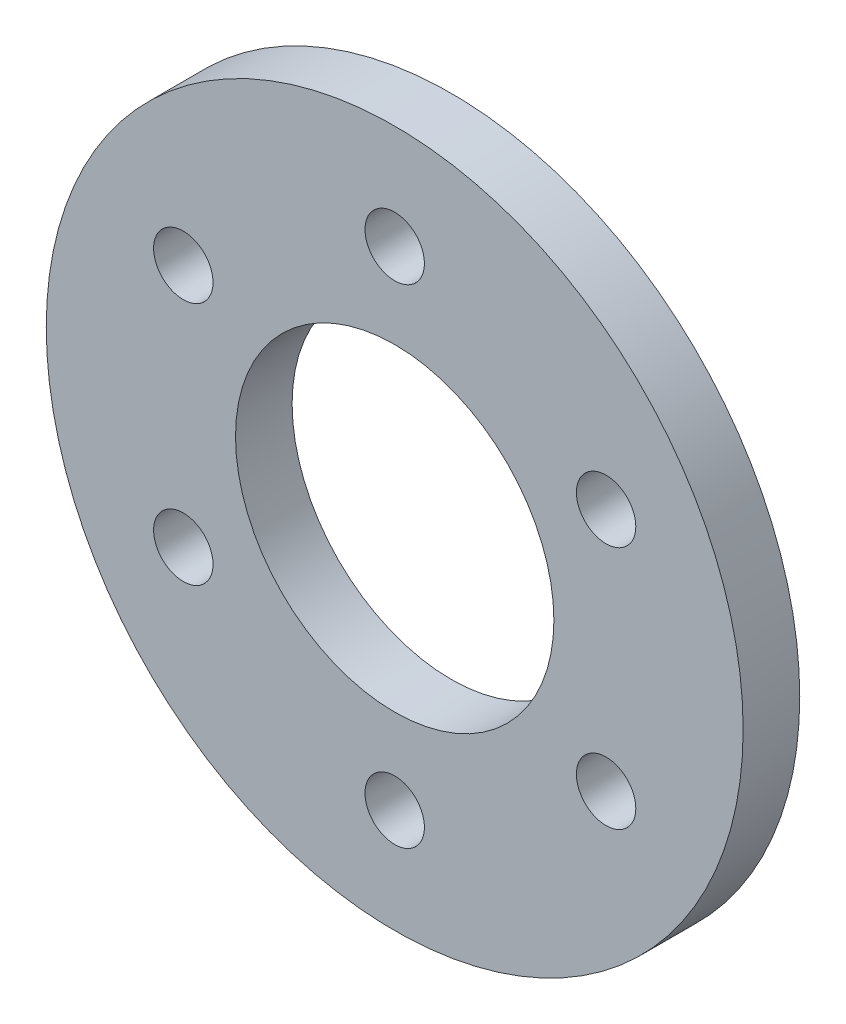
ISO-10303-21;
HEADER;
FILE_DESCRIPTION(('STEP AP214'),'2;1');
FILE_NAME('part.step','',(''),(''),'','','');
FILE_SCHEMA(('AUTOMOTIVE_DESIGN { 1 0 10303 214 1 1 1 1 }'));
ENDSEC;
DATA;
#1=APPLICATION_CONTEXT('core data for automotive mechanical design processes');
#2=APPLICATION_PROTOCOL_DEFINITION('international standard','automotive_design',2000,#1);
#3=PRODUCT_CONTEXT('',#1,'mechanical');
#4=PRODUCT('Part','Part','',(#3));
#5=PRODUCT_RELATED_PRODUCT_CATEGORY('part','',(#4));
#6=PRODUCT_DEFINITION_FORMATION('','',#4);
#7=PRODUCT_DEFINITION_CONTEXT('part definition',#1,'design');
#8=PRODUCT_DEFINITION('design','',#6,#7);
#9=PRODUCT_DEFINITION_SHAPE('','',#8);
#10=(LENGTH_UNIT() NAMED_UNIT(*) SI_UNIT(.MILLI.,.METRE.));
#11=(NAMED_UNIT(*) PLANE_ANGLE_UNIT() SI_UNIT($,.RADIAN.));
#12=(NAMED_UNIT(*) SI_UNIT($,.STERADIAN.) SOLID_ANGLE_UNIT());
#13=UNCERTAINTY_MEASURE_WITH_UNIT(LENGTH_MEASURE(1.E-05),#10,'distance_accuracy_value','');
#14=(GEOMETRIC_REPRESENTATION_CONTEXT(3) GLOBAL_UNCERTAINTY_ASSIGNED_CONTEXT((#13)) GLOBAL_UNIT_ASSIGNED_CONTEXT((#10,
#11,#12)) REPRESENTATION_CONTEXT('',''));
#15=CARTESIAN_POINT('',(0.,0.,0.));
#16=DIRECTION('',(0.,0.,1.));
#17=DIRECTION('',(1.,0.,0.));
#18=AXIS2_PLACEMENT_3D('',#15,#16,#17);
#19=CARTESIAN_POINT('',(0.,0.,4.));
#20=DIRECTION('',(0.,0.,1.));
#21=DIRECTION('',(1.,0.,0.));
#22=AXIS2_PLACEMENT_3D('',#19,#20,#21);
#23=PLANE('',#22);
#24=CARTESIAN_POINT('',(-14.9389382152816,8.62499999999999,4.));
#25=DIRECTION('',(0.,0.,1.));
#26=DIRECTION('',(1.,0.,0.));
#27=AXIS2_PLACEMENT_3D('',#24,#25,#26);
#28=CIRCLE('',#27,2.1);
#29=CARTESIAN_POINT('',(-12.8389382152816,8.62499999999999,4.));
#30=VERTEX_POINT('',#29);
#31=EDGE_CURVE('E74',#30,#30,#28,.T.);
#32=ORIENTED_EDGE('',*,*,#31,.F.);
#33=EDGE_LOOP('',(#32));
#34=FACE_BOUND('',#33,.T.);
#35=CARTESIAN_POINT('',(0.,-17.25,4.));
#36=DIRECTION('',(0.,0.,1.));
#37=DIRECTION('',(1.,0.,0.));
#38=AXIS2_PLACEMENT_3D('',#35,#36,#37);
#39=CIRCLE('',#38,2.1);
#40=CARTESIAN_POINT('',(2.1,-17.25,4.));
#41=VERTEX_POINT('',#40);
#42=EDGE_CURVE('E62',#41,#41,#39,.T.);
#43=ORIENTED_EDGE('',*,*,#42,.F.);
#44=EDGE_LOOP('',(#43));
#45=FACE_BOUND('',#44,.T.);
#46=CARTESIAN_POINT('',(14.9389382152816,8.62500000000001,4.));
#47=DIRECTION('',(0.,0.,1.));
#48=DIRECTION('',(1.,0.,0.));
#49=AXIS2_PLACEMENT_3D('',#46,#47,#48);
#50=CIRCLE('',#49,2.09999999999999);
#51=CARTESIAN_POINT('',(17.0389382152816,8.62500000000001,4.));
#52=VERTEX_POINT('',#51);
#53=EDGE_CURVE('E50',#52,#52,#50,.T.);
#54=ORIENTED_EDGE('',*,*,#53,.F.);
#55=EDGE_LOOP('',(#54));
#56=FACE_BOUND('',#55,.T.);
#57=CARTESIAN_POINT('',(0.,0.,4.));
#58=DIRECTION('',(0.,0.,1.));
#59=DIRECTION('',(1.,0.,0.));
#60=AXIS2_PLACEMENT_3D('',#57,#58,#59);
#61=CIRCLE('',#60,11.25);
#62=CARTESIAN_POINT('',(11.25,0.,4.));
#63=VERTEX_POINT('',#62);
#64=EDGE_CURVE('E11',#63,#63,#61,.T.);
#65=ORIENTED_EDGE('',*,*,#64,.F.);
#66=EDGE_LOOP('',(#65));
#67=FACE_BOUND('',#66,.T.);
#68=CARTESIAN_POINT('',(0.,17.25,4.));
#69=DIRECTION('',(0.,0.,1.));
#70=DIRECTION('',(1.,0.,0.));
#71=AXIS2_PLACEMENT_3D('',#68,#69,#70);
#72=CIRCLE('',#71,2.1);
#73=CARTESIAN_POINT('',(2.1,17.25,4.));
#74=VERTEX_POINT('',#73);
#75=EDGE_CURVE('E45',#74,#74,#72,.T.);
#76=ORIENTED_EDGE('',*,*,#75,.F.);
#77=EDGE_LOOP('',(#76));
#78=FACE_BOUND('',#77,.T.);
#79=CARTESIAN_POINT('',(14.9389382152816,-8.625,4.));
#80=DIRECTION('',(0.,0.,1.));
#81=DIRECTION('',(1.,0.,0.));
#82=AXIS2_PLACEMENT_3D('',#79,#80,#81);
#83=CIRCLE('',#82,2.1);
#84=CARTESIAN_POINT('',(17.0389382152816,-8.625,4.));
#85=VERTEX_POINT('',#84);
#86=EDGE_CURVE('E56',#85,#85,#83,.T.);
#87=ORIENTED_EDGE('',*,*,#86,.F.);
#88=EDGE_LOOP('',(#87));
#89=FACE_BOUND('',#88,.T.);
#90=CARTESIAN_POINT('',(-14.9389382152816,-8.62500000000001,4.));
#91=DIRECTION('',(0.,0.,1.));
#92=DIRECTION('',(1.,0.,0.));
#93=AXIS2_PLACEMENT_3D('',#90,#91,#92);
#94=CIRCLE('',#93,2.1);
#95=CARTESIAN_POINT('',(-12.8389382152816,-8.62500000000001,4.));
#96=VERTEX_POINT('',#95);
#97=EDGE_CURVE('E68',#96,#96,#94,.T.);
#98=ORIENTED_EDGE('',*,*,#97,.F.);
#99=EDGE_LOOP('',(#98));
#100=FACE_BOUND('',#99,.T.);
#101=CARTESIAN_POINT('',(0.,0.,4.));
#102=DIRECTION('',(0.,0.,-1.));
#103=DIRECTION('',(1.,0.,0.));
#104=AXIS2_PLACEMENT_3D('',#101,#102,#103);
#105=CIRCLE('',#104,24.625);
#106=CARTESIAN_POINT('',(24.625,0.,4.));
#107=VERTEX_POINT('',#106);
#108=EDGE_CURVE('E80',#107,#107,#105,.T.);
#109=ORIENTED_EDGE('',*,*,#108,.F.);
#110=EDGE_LOOP('',(#109));
#111=FACE_BOUND('',#110,.T.);
#112=ADVANCED_FACE('F34',(#34,#45,#56,#67,#78,#89,#100,#111),#23,.T.);
#113=CARTESIAN_POINT('',(0.,0.,0.));
#114=DIRECTION('',(0.,0.,1.));
#115=DIRECTION('',(1.,0.,0.));
#116=AXIS2_PLACEMENT_3D('',#113,#114,#115);
#117=PLANE('',#116);
#118=CARTESIAN_POINT('',(0.,0.,0.));
#119=DIRECTION('',(0.,0.,1.));
#120=DIRECTION('',(1.,0.,0.));
#121=AXIS2_PLACEMENT_3D('',#118,#119,#120);
#122=CIRCLE('',#121,11.25);
#123=CARTESIAN_POINT('',(11.25,0.,0.));
#124=VERTEX_POINT('',#123);
#125=EDGE_CURVE('E38',#124,#124,#122,.T.);
#126=ORIENTED_EDGE('',*,*,#125,.T.);
#127=EDGE_LOOP('',(#126));
#128=FACE_BOUND('',#127,.T.);
#129=CARTESIAN_POINT('',(0.,17.25,0.));
#130=DIRECTION('',(0.,0.,1.));
#131=DIRECTION('',(1.,0.,0.));
#132=AXIS2_PLACEMENT_3D('',#129,#130,#131);
#133=CIRCLE('',#132,2.1);
#134=CARTESIAN_POINT('',(2.1,17.25,0.));
#135=VERTEX_POINT('',#134);
#136=EDGE_CURVE('E47',#135,#135,#133,.T.);
#137=ORIENTED_EDGE('',*,*,#136,.T.);
#138=EDGE_LOOP('',(#137));
#139=FACE_BOUND('',#138,.T.);
#140=CARTESIAN_POINT('',(14.9389382152816,8.62500000000001,0.));
#141=DIRECTION('',(0.,0.,1.));
#142=DIRECTION('',(1.,0.,0.));
#143=AXIS2_PLACEMENT_3D('',#140,#141,#142);
#144=CIRCLE('',#143,2.09999999999999);
#145=CARTESIAN_POINT('',(17.0389382152816,8.62500000000001,0.));
#146=VERTEX_POINT('',#145);
#147=EDGE_CURVE('E53',#146,#146,#144,.T.);
#148=ORIENTED_EDGE('',*,*,#147,.T.);
#149=EDGE_LOOP('',(#148));
#150=FACE_BOUND('',#149,.T.);
#151=CARTESIAN_POINT('',(14.9389382152816,-8.625,0.));
#152=DIRECTION('',(0.,0.,1.));
#153=DIRECTION('',(1.,0.,0.));
#154=AXIS2_PLACEMENT_3D('',#151,#152,#153);
#155=CIRCLE('',#154,2.1);
#156=CARTESIAN_POINT('',(17.0389382152816,-8.625,0.));
#157=VERTEX_POINT('',#156);
#158=EDGE_CURVE('E59',#157,#157,#155,.T.);
#159=ORIENTED_EDGE('',*,*,#158,.T.);
#160=EDGE_LOOP('',(#159));
#161=FACE_BOUND('',#160,.T.);
#162=CARTESIAN_POINT('',(0.,-17.25,0.));
#163=DIRECTION('',(0.,0.,1.));
#164=DIRECTION('',(1.,0.,0.));
#165=AXIS2_PLACEMENT_3D('',#162,#163,#164);
#166=CIRCLE('',#165,2.1);
#167=CARTESIAN_POINT('',(2.1,-17.25,0.));
#168=VERTEX_POINT('',#167);
#169=EDGE_CURVE('E65',#168,#168,#166,.T.);
#170=ORIENTED_EDGE('',*,*,#169,.T.);
#171=EDGE_LOOP('',(#170));
#172=FACE_BOUND('',#171,.T.);
#173=CARTESIAN_POINT('',(-14.9389382152816,-8.62500000000001,0.));
#174=DIRECTION('',(0.,0.,1.));
#175=DIRECTION('',(1.,0.,0.));
#176=AXIS2_PLACEMENT_3D('',#173,#174,#175);
#177=CIRCLE('',#176,2.1);
#178=CARTESIAN_POINT('',(-12.8389382152816,-8.62500000000001,0.));
#179=VERTEX_POINT('',#178);
#180=EDGE_CURVE('E71',#179,#179,#177,.T.);
#181=ORIENTED_EDGE('',*,*,#180,.T.);
#182=EDGE_LOOP('',(#181));
#183=FACE_BOUND('',#182,.T.);
#184=CARTESIAN_POINT('',(-14.9389382152816,8.62499999999999,0.));
#185=DIRECTION('',(0.,0.,1.));
#186=DIRECTION('',(1.,0.,0.));
#187=AXIS2_PLACEMENT_3D('',#184,#185,#186);
#188=CIRCLE('',#187,2.1);
#189=CARTESIAN_POINT('',(-12.8389382152816,8.62499999999999,0.));
#190=VERTEX_POINT('',#189);
#191=EDGE_CURVE('E77',#190,#190,#188,.T.);
#192=ORIENTED_EDGE('',*,*,#191,.T.);
#193=EDGE_LOOP('',(#192));
#194=FACE_BOUND('',#193,.T.);
#195=CARTESIAN_POINT('',(0.,0.,0.));
#196=DIRECTION('',(0.,0.,-1.));
#197=DIRECTION('',(1.,0.,0.));
#198=AXIS2_PLACEMENT_3D('',#195,#196,#197);
#199=CIRCLE('',#198,24.625);
#200=CARTESIAN_POINT('',(24.625,0.,0.));
#201=VERTEX_POINT('',#200);
#202=EDGE_CURVE('E83',#201,#201,#199,.T.);
#203=ORIENTED_EDGE('',*,*,#202,.T.);
#204=EDGE_LOOP('',(#203));
#205=FACE_BOUND('',#204,.T.);
#206=ADVANCED_FACE('F36',(#128,#139,#150,#161,#172,#183,#194,#205),#117,.F.);
#207=CARTESIAN_POINT('',(0.,0.,4.));
#208=DIRECTION('',(0.,0.,-1.));
#209=DIRECTION('',(-1.,0.,0.));
#210=AXIS2_PLACEMENT_3D('',#207,#208,#209);
#211=CYLINDRICAL_SURFACE('',#210,11.25);
#212=ORIENTED_EDGE('',*,*,#64,.T.);
#213=EDGE_LOOP('',(#212));
#214=FACE_BOUND('',#213,.T.);
#215=ORIENTED_EDGE('',*,*,#125,.F.);
#216=EDGE_LOOP('',(#215));
#217=FACE_BOUND('',#216,.T.);
#218=ADVANCED_FACE('F96',(#214,#217),#211,.F.);
#219=CARTESIAN_POINT('',(0.,17.25,4.));
#220=DIRECTION('',(0.,0.,-1.));
#221=DIRECTION('',(-1.,0.,0.));
#222=AXIS2_PLACEMENT_3D('',#219,#220,#221);
#223=CYLINDRICAL_SURFACE('',#222,2.1);
#224=ORIENTED_EDGE('',*,*,#75,.T.);
#225=EDGE_LOOP('',(#224));
#226=FACE_BOUND('',#225,.T.);
#227=ORIENTED_EDGE('',*,*,#136,.F.);
#228=EDGE_LOOP('',(#227));
#229=FACE_BOUND('',#228,.T.);
#230=ADVANCED_FACE('F103',(#226,#229),#223,.F.);
#231=CARTESIAN_POINT('',(14.9389382152816,8.62500000000001,4.));
#232=DIRECTION('',(0.,0.,-1.));
#233=DIRECTION('',(-1.,0.,0.));
#234=AXIS2_PLACEMENT_3D('',#231,#232,#233);
#235=CYLINDRICAL_SURFACE('',#234,2.09999999999999);
#236=ORIENTED_EDGE('',*,*,#53,.T.);
#237=EDGE_LOOP('',(#236));
#238=FACE_BOUND('',#237,.T.);
#239=ORIENTED_EDGE('',*,*,#147,.F.);
#240=EDGE_LOOP('',(#239));
#241=FACE_BOUND('',#240,.T.);
#242=ADVANCED_FACE('F106',(#238,#241),#235,.F.);
#243=CARTESIAN_POINT('',(14.9389382152816,-8.625,4.));
#244=DIRECTION('',(0.,0.,-1.));
#245=DIRECTION('',(-1.,0.,0.));
#246=AXIS2_PLACEMENT_3D('',#243,#244,#245);
#247=CYLINDRICAL_SURFACE('',#246,2.1);
#248=ORIENTED_EDGE('',*,*,#86,.T.);
#249=EDGE_LOOP('',(#248));
#250=FACE_BOUND('',#249,.T.);
#251=ORIENTED_EDGE('',*,*,#158,.F.);
#252=EDGE_LOOP('',(#251));
#253=FACE_BOUND('',#252,.T.);
#254=ADVANCED_FACE('F110',(#250,#253),#247,.F.);
#255=CARTESIAN_POINT('',(0.,-17.25,4.));
#256=DIRECTION('',(0.,0.,-1.));
#257=DIRECTION('',(-1.,0.,0.));
#258=AXIS2_PLACEMENT_3D('',#255,#256,#257);
#259=CYLINDRICAL_SURFACE('',#258,2.1);
#260=ORIENTED_EDGE('',*,*,#42,.T.);
#261=EDGE_LOOP('',(#260));
#262=FACE_BOUND('',#261,.T.);
#263=ORIENTED_EDGE('',*,*,#169,.F.);
#264=EDGE_LOOP('',(#263));
#265=FACE_BOUND('',#264,.T.);
#266=ADVANCED_FACE('F114',(#262,#265),#259,.F.);
#267=CARTESIAN_POINT('',(-14.9389382152816,-8.62500000000001,4.));
#268=DIRECTION('',(0.,0.,-1.));
#269=DIRECTION('',(-1.,0.,0.));
#270=AXIS2_PLACEMENT_3D('',#267,#268,#269);
#271=CYLINDRICAL_SURFACE('',#270,2.1);
#272=ORIENTED_EDGE('',*,*,#97,.T.);
#273=EDGE_LOOP('',(#272));
#274=FACE_BOUND('',#273,.T.);
#275=ORIENTED_EDGE('',*,*,#180,.F.);
#276=EDGE_LOOP('',(#275));
#277=FACE_BOUND('',#276,.T.);
#278=ADVANCED_FACE('F118',(#274,#277),#271,.F.);
#279=CARTESIAN_POINT('',(-14.9389382152816,8.62499999999999,4.));
#280=DIRECTION('',(0.,0.,-1.));
#281=DIRECTION('',(-1.,0.,0.));
#282=AXIS2_PLACEMENT_3D('',#279,#280,#281);
#283=CYLINDRICAL_SURFACE('',#282,2.1);
#284=ORIENTED_EDGE('',*,*,#31,.T.);
#285=EDGE_LOOP('',(#284));
#286=FACE_BOUND('',#285,.T.);
#287=ORIENTED_EDGE('',*,*,#191,.F.);
#288=EDGE_LOOP('',(#287));
#289=FACE_BOUND('',#288,.T.);
#290=ADVANCED_FACE('F122',(#286,#289),#283,.F.);
#291=CARTESIAN_POINT('',(0.,0.,4.));
#292=DIRECTION('',(0.,0.,-1.));
#293=DIRECTION('',(-1.,0.,0.));
#294=AXIS2_PLACEMENT_3D('',#291,#292,#293);
#295=CYLINDRICAL_SURFACE('',#294,24.625);
#296=ORIENTED_EDGE('',*,*,#202,.F.);
#297=EDGE_LOOP('',(#296));
#298=FACE_BOUND('',#297,.T.);
#299=ORIENTED_EDGE('',*,*,#108,.T.);
#300=EDGE_LOOP('',(#299));
#301=FACE_BOUND('',#300,.T.);
#302=ADVANCED_FACE('F89',(#298,#301),#295,.T.);
#303=CLOSED_SHELL('',(#112,#206,#218,#230,#242,#254,#266,#278,#290,#302));
#304=MANIFOLD_SOLID_BREP('B2',#303);
#305=ADVANCED_BREP_SHAPE_REPRESENTATION('',(#18,#304),#14);
#306=SHAPE_DEFINITION_REPRESENTATION(#9,#305);
ENDSEC;
END-ISO-10303-21;
